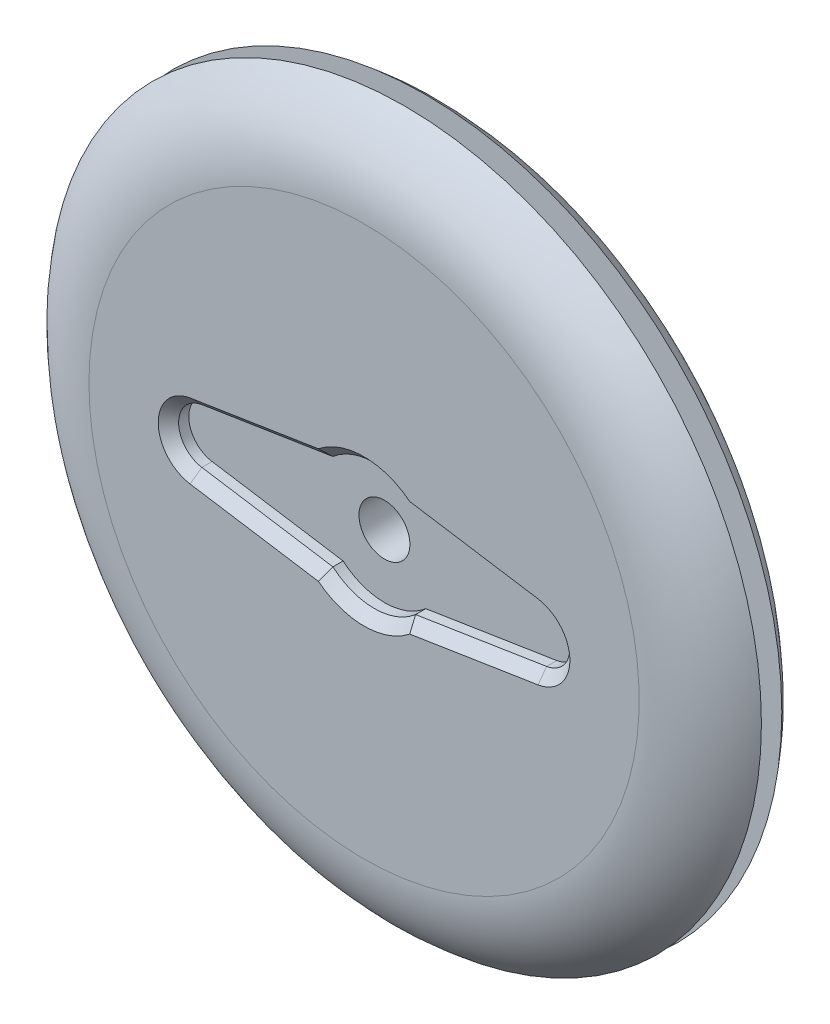
ISO-10303-21;
HEADER;
FILE_DESCRIPTION(('STEP AP214'),'2;1');
FILE_NAME('part.step','',(''),(''),'','','');
FILE_SCHEMA(('AUTOMOTIVE_DESIGN { 1 0 10303 214 1 1 1 1 }'));
ENDSEC;
DATA;
#1=APPLICATION_CONTEXT('core data for automotive mechanical design processes');
#2=APPLICATION_PROTOCOL_DEFINITION('international standard','automotive_design',2000,#1);
#3=PRODUCT_CONTEXT('',#1,'mechanical');
#4=PRODUCT('Part','Part','',(#3));
#5=PRODUCT_RELATED_PRODUCT_CATEGORY('part','',(#4));
#6=PRODUCT_DEFINITION_FORMATION('','',#4);
#7=PRODUCT_DEFINITION_CONTEXT('part definition',#1,'design');
#8=PRODUCT_DEFINITION('design','',#6,#7);
#9=PRODUCT_DEFINITION_SHAPE('','',#8);
#10=(LENGTH_UNIT() NAMED_UNIT(*) SI_UNIT(.MILLI.,.METRE.));
#11=(NAMED_UNIT(*) PLANE_ANGLE_UNIT() SI_UNIT($,.RADIAN.));
#12=(NAMED_UNIT(*) SI_UNIT($,.STERADIAN.) SOLID_ANGLE_UNIT());
#13=UNCERTAINTY_MEASURE_WITH_UNIT(LENGTH_MEASURE(1.E-05),#10,'distance_accuracy_value','');
#14=(GEOMETRIC_REPRESENTATION_CONTEXT(3) GLOBAL_UNCERTAINTY_ASSIGNED_CONTEXT((#13)) GLOBAL_UNIT_ASSIGNED_CONTEXT((#10,
#11,#12)) REPRESENTATION_CONTEXT('',''));
#15=CARTESIAN_POINT('',(0.,0.,0.));
#16=DIRECTION('',(0.,0.,1.));
#17=DIRECTION('',(1.,0.,0.));
#18=AXIS2_PLACEMENT_3D('',#15,#16,#17);
#19=CARTESIAN_POINT('',(0.,0.,0.));
#20=DIRECTION('',(0.,0.,-1.));
#21=DIRECTION('',(-1.,0.,0.));
#22=AXIS2_PLACEMENT_3D('',#19,#20,#21);
#23=PLANE('',#22);
#24=CARTESIAN_POINT('',(0.,0.,0.));
#25=DIRECTION('',(0.,0.,1.));
#26=DIRECTION('',(1.,0.,0.));
#27=AXIS2_PLACEMENT_3D('',#24,#25,#26);
#28=CIRCLE('',#27,2.5);
#29=CARTESIAN_POINT('',(2.5,0.,0.));
#30=VERTEX_POINT('',#29);
#31=EDGE_CURVE('E205',#30,#30,#28,.T.);
#32=ORIENTED_EDGE('',*,*,#31,.F.);
#33=EDGE_LOOP('',(#32));
#34=FACE_BOUND('',#33,.T.);
#35=CARTESIAN_POINT('',(0.,0.,0.));
#36=DIRECTION('',(0.,0.,-1.));
#37=DIRECTION('',(-1.,0.,0.));
#38=AXIS2_PLACEMENT_3D('',#35,#36,#37);
#39=CIRCLE('',#38,6.20000000000002);
#40=CARTESIAN_POINT('',(4.05671289075597,4.68861179049559,0.));
#41=VERTEX_POINT('',#40);
#42=CARTESIAN_POINT('',(-4.05671289075597,4.68861179049559,0.));
#43=VERTEX_POINT('',#42);
#44=EDGE_CURVE('E168',#41,#43,#39,.F.);
#45=ORIENTED_EDGE('',*,*,#44,.T.);
#46=DIRECTION('',(-0.987875892570632,-0.155245679095352,0.));
#47=VECTOR('',#46,1.);
#48=CARTESIAN_POINT('',(-4.05671289075597,4.68861179049559,0.));
#49=LINE('',#48,#47);
#50=CARTESIAN_POINT('',(-16.9191633335575,2.66726490994071,0.));
#51=VERTEX_POINT('',#50);
#52=EDGE_CURVE('E162',#43,#51,#49,.T.);
#53=ORIENTED_EDGE('',*,*,#52,.T.);
#54=CARTESIAN_POINT('',(-16.5,0.,0.));
#55=DIRECTION('',(0.,0.,-1.));
#56=DIRECTION('',(-1.,0.,0.));
#57=AXIS2_PLACEMENT_3D('',#54,#55,#56);
#58=CIRCLE('',#57,2.7);
#59=CARTESIAN_POINT('',(-16.9191633335574,-2.66726490994071,0.));
#60=VERTEX_POINT('',#59);
#61=EDGE_CURVE('E152',#51,#60,#58,.F.);
#62=ORIENTED_EDGE('',*,*,#61,.T.);
#63=DIRECTION('',(0.987875892570632,-0.155245679095352,0.));
#64=VECTOR('',#63,1.);
#65=CARTESIAN_POINT('',(-16.9191633335574,-2.66726490994071,0.));
#66=LINE('',#65,#64);
#67=CARTESIAN_POINT('',(-4.05671289075597,-4.68861179049559,0.));
#68=VERTEX_POINT('',#67);
#69=EDGE_CURVE('E186',#60,#68,#66,.T.);
#70=ORIENTED_EDGE('',*,*,#69,.T.);
#71=CARTESIAN_POINT('',(0.,0.,0.));
#72=DIRECTION('',(0.,0.,-1.));
#73=DIRECTION('',(-1.,0.,0.));
#74=AXIS2_PLACEMENT_3D('',#71,#72,#73);
#75=CIRCLE('',#74,6.2);
#76=CARTESIAN_POINT('',(4.05671289075597,-4.68861179049559,0.));
#77=VERTEX_POINT('',#76);
#78=EDGE_CURVE('E184',#68,#77,#75,.F.);
#79=ORIENTED_EDGE('',*,*,#78,.T.);
#80=DIRECTION('',(0.987875892570632,0.155245679095352,0.));
#81=VECTOR('',#80,1.);
#82=CARTESIAN_POINT('',(4.05671289075597,-4.68861179049559,0.));
#83=LINE('',#82,#81);
#84=CARTESIAN_POINT('',(16.9191633335575,-2.66726490994071,0.));
#85=VERTEX_POINT('',#84);
#86=EDGE_CURVE('E181',#77,#85,#83,.T.);
#87=ORIENTED_EDGE('',*,*,#86,.T.);
#88=CARTESIAN_POINT('',(16.5,0.,0.));
#89=DIRECTION('',(0.,0.,-1.));
#90=DIRECTION('',(-1.,0.,0.));
#91=AXIS2_PLACEMENT_3D('',#88,#89,#90);
#92=CIRCLE('',#91,2.7);
#93=CARTESIAN_POINT('',(16.9191633335575,2.66726490994071,0.));
#94=VERTEX_POINT('',#93);
#95=EDGE_CURVE('E180',#85,#94,#92,.F.);
#96=ORIENTED_EDGE('',*,*,#95,.T.);
#97=DIRECTION('',(-0.987875892570632,0.155245679095352,0.));
#98=VECTOR('',#97,1.);
#99=CARTESIAN_POINT('',(16.9191633335575,2.66726490994071,0.));
#100=LINE('',#99,#98);
#101=EDGE_CURVE('E172',#94,#41,#100,.T.);
#102=ORIENTED_EDGE('',*,*,#101,.T.);
#103=EDGE_LOOP('',(#45,#53,#62,#70,#79,#87,#96,#102));
#104=FACE_BOUND('',#103,.T.);
#105=ADVANCED_FACE('F52',(#34,#104),#23,.F.);
#106=CARTESIAN_POINT('',(0.,0.,-2.));
#107=DIRECTION('',(0.,0.,-1.));
#108=DIRECTION('',(-1.,0.,0.));
#109=AXIS2_PLACEMENT_3D('',#106,#107,#108);
#110=PLANE('',#109);
#111=CARTESIAN_POINT('',(0.,0.,-2.));
#112=DIRECTION('',(0.,0.,-1.));
#113=DIRECTION('',(-1.,0.,0.));
#114=AXIS2_PLACEMENT_3D('',#111,#112,#113);
#115=CIRCLE('',#114,25.);
#116=CARTESIAN_POINT('',(-25.,0.,-2.));
#117=VERTEX_POINT('',#116);
#118=EDGE_CURVE('E213',#117,#117,#115,.T.);
#119=ORIENTED_EDGE('',*,*,#118,.F.);
#120=EDGE_LOOP('',(#119));
#121=FACE_BOUND('',#120,.T.);
#122=CARTESIAN_POINT('',(0.,0.,-2.));
#123=DIRECTION('',(0.,0.,-1.));
#124=DIRECTION('',(-1.,0.,0.));
#125=AXIS2_PLACEMENT_3D('',#122,#123,#124);
#126=CIRCLE('',#125,35.);
#127=CARTESIAN_POINT('',(-35.,0.,-2.));
#128=VERTEX_POINT('',#127);
#129=EDGE_CURVE('E218',#128,#128,#126,.T.);
#130=ORIENTED_EDGE('',*,*,#129,.T.);
#131=EDGE_LOOP('',(#130));
#132=FACE_BOUND('',#131,.T.);
#133=ADVANCED_FACE('F385',(#121,#132),#110,.T.);
#134=CARTESIAN_POINT('',(0.,0.,2.));
#135=DIRECTION('',(0.,0.,-1.));
#136=DIRECTION('',(-1.,0.,0.));
#137=AXIS2_PLACEMENT_3D('',#134,#135,#136);
#138=PLANE('',#137);
#139=CARTESIAN_POINT('',(16.5,0.,2.));
#140=DIRECTION('',(0.,0.,-1.));
#141=DIRECTION('',(-1.,0.,0.));
#142=AXIS2_PLACEMENT_3D('',#139,#140,#141);
#143=CIRCLE('',#142,3.70000000000002);
#144=CARTESIAN_POINT('',(17.0744090126528,3.65514080251136,2.));
#145=VERTEX_POINT('',#144);
#146=CARTESIAN_POINT('',(17.0744090126528,-3.65514080251136,2.));
#147=VERTEX_POINT('',#146);
#148=EDGE_CURVE('E245',#145,#147,#143,.T.);
#149=ORIENTED_EDGE('',*,*,#148,.T.);
#150=DIRECTION('',(-0.987875892570632,-0.155245679095352,0.));
#151=VECTOR('',#150,1.);
#152=CARTESIAN_POINT('',(0.972079157136123,-6.18563795527826,2.));
#153=LINE('',#152,#151);
#154=CARTESIAN_POINT('',(4.48327208773925,-5.63385049387171,2.));
#155=VERTEX_POINT('',#154);
#156=EDGE_CURVE('E242',#147,#155,#153,.T.);
#157=ORIENTED_EDGE('',*,*,#156,.T.);
#158=CARTESIAN_POINT('',(0.,0.,2.));
#159=DIRECTION('',(0.,0.,-1.));
#160=DIRECTION('',(-1.,0.,0.));
#161=AXIS2_PLACEMENT_3D('',#158,#159,#160);
#162=CIRCLE('',#161,7.20000000000003);
#163=CARTESIAN_POINT('',(-4.48327208773927,-5.63385049387169,2.));
#164=VERTEX_POINT('',#163);
#165=EDGE_CURVE('E237',#155,#164,#162,.T.);
#166=ORIENTED_EDGE('',*,*,#165,.T.);
#167=DIRECTION('',(-0.987875892570632,0.155245679095352,0.));
#168=VECTOR('',#167,1.);
#169=CARTESIAN_POINT('',(-0.972079157136121,-6.18563795527825,2.));
#170=LINE('',#169,#168);
#171=CARTESIAN_POINT('',(-17.0744090126528,-3.65514080251135,2.));
#172=VERTEX_POINT('',#171);
#173=EDGE_CURVE('E232',#164,#172,#170,.T.);
#174=ORIENTED_EDGE('',*,*,#173,.T.);
#175=CARTESIAN_POINT('',(-16.5,0.,2.));
#176=DIRECTION('',(0.,0.,-1.));
#177=DIRECTION('',(-1.,0.,0.));
#178=AXIS2_PLACEMENT_3D('',#175,#176,#177);
#179=CIRCLE('',#178,3.70000000000001);
#180=CARTESIAN_POINT('',(-17.0744090126528,3.65514080251135,2.));
#181=VERTEX_POINT('',#180);
#182=EDGE_CURVE('E231',#172,#181,#179,.T.);
#183=ORIENTED_EDGE('',*,*,#182,.T.);
#184=DIRECTION('',(0.987875892570632,0.155245679095352,0.));
#185=VECTOR('',#184,1.);
#186=CARTESIAN_POINT('',(-0.972079157136122,6.18563795527825,2.));
#187=LINE('',#186,#185);
#188=CARTESIAN_POINT('',(-4.48327208773924,5.6338504938717,2.));
#189=VERTEX_POINT('',#188);
#190=EDGE_CURVE('E230',#181,#189,#187,.T.);
#191=ORIENTED_EDGE('',*,*,#190,.T.);
#192=CARTESIAN_POINT('',(0.,0.,2.));
#193=DIRECTION('',(0.,0.,-1.));
#194=DIRECTION('',(-1.,0.,0.));
#195=AXIS2_PLACEMENT_3D('',#192,#193,#194);
#196=CIRCLE('',#195,7.20000000000003);
#197=CARTESIAN_POINT('',(4.48327208773922,5.63385049387171,2.));
#198=VERTEX_POINT('',#197);
#199=EDGE_CURVE('E233',#189,#198,#196,.T.);
#200=ORIENTED_EDGE('',*,*,#199,.T.);
#201=DIRECTION('',(0.987875892570632,-0.155245679095352,0.));
#202=VECTOR('',#201,1.);
#203=CARTESIAN_POINT('',(0.972079157136123,6.18563795527826,2.));
#204=LINE('',#203,#202);
#205=EDGE_CURVE('E240',#198,#145,#204,.T.);
#206=ORIENTED_EDGE('',*,*,#205,.T.);
#207=EDGE_LOOP('',(#149,#157,#166,#174,#183,#191,#200,#206));
#208=FACE_BOUND('',#207,.T.);
#209=CARTESIAN_POINT('',(0.,0.,2.));
#210=DIRECTION('',(0.,0.,-1.));
#211=DIRECTION('',(-1.,0.,0.));
#212=AXIS2_PLACEMENT_3D('',#209,#210,#211);
#213=CIRCLE('',#212,27.);
#214=CARTESIAN_POINT('',(-27.,0.,2.));
#215=VERTEX_POINT('',#214);
#216=EDGE_CURVE('E221',#215,#215,#213,.F.);
#217=ORIENTED_EDGE('',*,*,#216,.T.);
#218=EDGE_LOOP('',(#217));
#219=FACE_BOUND('',#218,.T.);
#220=ADVANCED_FACE('F347',(#208,#219),#138,.F.);
#221=CARTESIAN_POINT('',(0.,0.,-8.));
#222=DIRECTION('',(0.,0.,1.));
#223=DIRECTION('',(1.,0.,0.));
#224=AXIS2_PLACEMENT_3D('',#221,#222,#223);
#225=TOROIDAL_SURFACE('',#224,27.,10.);
#226=ORIENTED_EDGE('',*,*,#216,.F.);
#227=EDGE_LOOP('',(#226));
#228=FACE_BOUND('',#227,.T.);
#229=ORIENTED_EDGE('',*,*,#129,.F.);
#230=EDGE_LOOP('',(#229));
#231=FACE_BOUND('',#230,.T.);
#232=ADVANCED_FACE('F395',(#228,#231),#225,.T.);
#233=CARTESIAN_POINT('',(0.,0.,-4.));
#234=DIRECTION('',(0.,0.,1.));
#235=DIRECTION('',(1.,0.,0.));
#236=AXIS2_PLACEMENT_3D('',#233,#234,#235);
#237=CYLINDRICAL_SURFACE('',#236,25.);
#238=CARTESIAN_POINT('',(0.,0.,-4.));
#239=DIRECTION('',(0.,0.,-1.));
#240=DIRECTION('',(-1.,0.,0.));
#241=AXIS2_PLACEMENT_3D('',#238,#239,#240);
#242=CIRCLE('',#241,25.);
#243=CARTESIAN_POINT('',(-25.,0.,-4.));
#244=VERTEX_POINT('',#243);
#245=EDGE_CURVE('E212',#244,#244,#242,.T.);
#246=ORIENTED_EDGE('',*,*,#245,.F.);
#247=EDGE_LOOP('',(#246));
#248=FACE_BOUND('',#247,.T.);
#249=ORIENTED_EDGE('',*,*,#118,.T.);
#250=EDGE_LOOP('',(#249));
#251=FACE_BOUND('',#250,.T.);
#252=ADVANCED_FACE('F399',(#248,#251),#237,.T.);
#253=CARTESIAN_POINT('',(0.,0.,-4.));
#254=DIRECTION('',(0.,0.,1.));
#255=DIRECTION('',(-1.,0.,0.));
#256=AXIS2_PLACEMENT_3D('',#253,#254,#255);
#257=PLANE('',#256);
#258=ORIENTED_EDGE('',*,*,#245,.T.);
#259=EDGE_LOOP('',(#258));
#260=FACE_BOUND('',#259,.T.);
#261=CARTESIAN_POINT('',(0.,0.,-4.));
#262=DIRECTION('',(0.,0.,-1.));
#263=DIRECTION('',(-1.,0.,0.));
#264=AXIS2_PLACEMENT_3D('',#261,#262,#263);
#265=CIRCLE('',#264,35.);
#266=CARTESIAN_POINT('',(-35.,0.,-4.));
#267=VERTEX_POINT('',#266);
#268=EDGE_CURVE('E206',#267,#267,#265,.T.);
#269=ORIENTED_EDGE('',*,*,#268,.F.);
#270=EDGE_LOOP('',(#269));
#271=FACE_BOUND('',#270,.T.);
#272=ADVANCED_FACE('F403',(#260,#271),#257,.T.);
#273=CARTESIAN_POINT('',(0.,0.,-8.));
#274=DIRECTION('',(0.,0.,1.));
#275=DIRECTION('',(-1.,0.,0.));
#276=AXIS2_PLACEMENT_3D('',#273,#274,#275);
#277=PLANE('',#276);
#278=CARTESIAN_POINT('',(0.,0.,-8.));
#279=DIRECTION('',(0.,0.,1.));
#280=DIRECTION('',(1.,0.,0.));
#281=AXIS2_PLACEMENT_3D('',#278,#279,#280);
#282=CIRCLE('',#281,2.5);
#283=CARTESIAN_POINT('',(2.5,0.,-8.));
#284=VERTEX_POINT('',#283);
#285=EDGE_CURVE('E204',#284,#284,#282,.F.);
#286=ORIENTED_EDGE('',*,*,#285,.F.);
#287=EDGE_LOOP('',(#286));
#288=FACE_BOUND('',#287,.T.);
#289=CARTESIAN_POINT('',(0.,0.,-8.));
#290=DIRECTION('',(0.,0.,-1.));
#291=DIRECTION('',(-1.,0.,0.));
#292=AXIS2_PLACEMENT_3D('',#289,#290,#291);
#293=CIRCLE('',#292,27.);
#294=CARTESIAN_POINT('',(-27.,0.,-8.));
#295=VERTEX_POINT('',#294);
#296=EDGE_CURVE('E214',#295,#295,#293,.F.);
#297=ORIENTED_EDGE('',*,*,#296,.F.);
#298=EDGE_LOOP('',(#297));
#299=FACE_BOUND('',#298,.T.);
#300=ADVANCED_FACE('F414',(#288,#299),#277,.F.);
#301=CARTESIAN_POINT('',(0.,0.,2.));
#302=DIRECTION('',(0.,0.,-1.));
#303=DIRECTION('',(1.,0.,0.));
#304=AXIS2_PLACEMENT_3D('',#301,#302,#303);
#305=TOROIDAL_SURFACE('',#304,27.,10.);
#306=ORIENTED_EDGE('',*,*,#296,.T.);
#307=EDGE_LOOP('',(#306));
#308=FACE_BOUND('',#307,.T.);
#309=ORIENTED_EDGE('',*,*,#268,.T.);
#310=EDGE_LOOP('',(#309));
#311=FACE_BOUND('',#310,.T.);
#312=ADVANCED_FACE('F419',(#308,#311),#305,.T.);
#313=CARTESIAN_POINT('',(0.,0.,-8.001));
#314=DIRECTION('',(0.,0.,1.));
#315=DIRECTION('',(1.,0.,0.));
#316=AXIS2_PLACEMENT_3D('',#313,#314,#315);
#317=CYLINDRICAL_SURFACE('',#316,2.5);
#318=ORIENTED_EDGE('',*,*,#31,.T.);
#319=EDGE_LOOP('',(#318));
#320=FACE_BOUND('',#319,.T.);
#321=ORIENTED_EDGE('',*,*,#285,.T.);
#322=EDGE_LOOP('',(#321));
#323=FACE_BOUND('',#322,.T.);
#324=ADVANCED_FACE('F421',(#320,#323),#317,.F.);
#325=CARTESIAN_POINT('',(-4.05671289075597,4.68861179049559,-40.3524472615974));
#326=DIRECTION('',(-0.155245679095352,0.987875892570632,0.));
#327=DIRECTION('',(-0.987875892570632,-0.155245679095352,0.));
#328=AXIS2_PLACEMENT_3D('',#325,#326,#327);
#329=PLANE('',#328);
#330=DIRECTION('',(0.,0.,1.));
#331=VECTOR('',#330,1.);
#332=CARTESIAN_POINT('',(-4.05671289075597,4.68861179049559,-40.3524472615974));
#333=LINE('',#332,#331);
#334=CARTESIAN_POINT('',(-4.05671289075597,4.68861179049559,1.));
#335=VERTEX_POINT('',#334);
#336=EDGE_CURVE('E175',#43,#335,#333,.T.);
#337=ORIENTED_EDGE('',*,*,#336,.T.);
#338=DIRECTION('',(-0.987875892570632,-0.155245679095352,0.));
#339=VECTOR('',#338,1.);
#340=CARTESIAN_POINT('',(-4.05671289075597,4.68861179049559,1.));
#341=LINE('',#340,#339);
#342=CARTESIAN_POINT('',(-16.9191633335575,2.66726490994071,1.));
#343=VERTEX_POINT('',#342);
#344=EDGE_CURVE('E12',#335,#343,#341,.T.);
#345=ORIENTED_EDGE('',*,*,#344,.T.);
#346=DIRECTION('',(0.,0.,1.));
#347=VECTOR('',#346,1.);
#348=CARTESIAN_POINT('',(-16.9191633335575,2.66726490994071,-40.3524472615974));
#349=LINE('',#348,#347);
#350=EDGE_CURVE('E153',#51,#343,#349,.T.);
#351=ORIENTED_EDGE('',*,*,#350,.F.);
#352=ORIENTED_EDGE('',*,*,#52,.F.);
#353=EDGE_LOOP('',(#337,#345,#351,#352));
#354=FACE_BOUND('',#353,.T.);
#355=ADVANCED_FACE('F163',(#354),#329,.F.);
#356=CARTESIAN_POINT('',(-16.5,0.,-40.3524472615974));
#357=DIRECTION('',(0.,0.,1.));
#358=DIRECTION('',(1.,0.,0.));
#359=AXIS2_PLACEMENT_3D('',#356,#357,#358);
#360=CYLINDRICAL_SURFACE('',#359,2.7);
#361=ORIENTED_EDGE('',*,*,#350,.T.);
#362=CARTESIAN_POINT('',(-16.5,0.,1.));
#363=DIRECTION('',(0.,0.,-1.));
#364=DIRECTION('',(-1.,0.,0.));
#365=AXIS2_PLACEMENT_3D('',#362,#363,#364);
#366=CIRCLE('',#365,2.7);
#367=CARTESIAN_POINT('',(-16.9191633335574,-2.66726490994071,1.));
#368=VERTEX_POINT('',#367);
#369=EDGE_CURVE('E251',#343,#368,#366,.F.);
#370=ORIENTED_EDGE('',*,*,#369,.T.);
#371=DIRECTION('',(0.,0.,1.));
#372=VECTOR('',#371,1.);
#373=CARTESIAN_POINT('',(-16.9191633335574,-2.66726490994071,-40.3524472615974));
#374=LINE('',#373,#372);
#375=EDGE_CURVE('E158',#60,#368,#374,.T.);
#376=ORIENTED_EDGE('',*,*,#375,.F.);
#377=ORIENTED_EDGE('',*,*,#61,.F.);
#378=EDGE_LOOP('',(#361,#370,#376,#377));
#379=FACE_BOUND('',#378,.T.);
#380=ADVANCED_FACE('F155',(#379),#360,.F.);
#381=CARTESIAN_POINT('',(-16.9191633335574,-2.66726490994071,-40.3524472615974));
#382=DIRECTION('',(-0.155245679095352,-0.987875892570632,0.));
#383=DIRECTION('',(0.987875892570632,-0.155245679095352,0.));
#384=AXIS2_PLACEMENT_3D('',#381,#382,#383);
#385=PLANE('',#384);
#386=ORIENTED_EDGE('',*,*,#375,.T.);
#387=DIRECTION('',(0.987875892570632,-0.155245679095352,0.));
#388=VECTOR('',#387,1.);
#389=CARTESIAN_POINT('',(-16.9191633335574,-2.66726490994071,1.));
#390=LINE('',#389,#388);
#391=CARTESIAN_POINT('',(-4.05671289075597,-4.68861179049559,1.));
#392=VERTEX_POINT('',#391);
#393=EDGE_CURVE('E255',#368,#392,#390,.T.);
#394=ORIENTED_EDGE('',*,*,#393,.T.);
#395=DIRECTION('',(0.,0.,1.));
#396=VECTOR('',#395,1.);
#397=CARTESIAN_POINT('',(-4.05671289075597,-4.68861179049559,-40.3524472615974));
#398=LINE('',#397,#396);
#399=EDGE_CURVE('E189',#68,#392,#398,.T.);
#400=ORIENTED_EDGE('',*,*,#399,.F.);
#401=ORIENTED_EDGE('',*,*,#69,.F.);
#402=EDGE_LOOP('',(#386,#394,#400,#401));
#403=FACE_BOUND('',#402,.T.);
#404=ADVANCED_FACE('F357',(#403),#385,.F.);
#405=CARTESIAN_POINT('',(0.,0.,-40.3524472615974));
#406=DIRECTION('',(0.,0.,1.));
#407=DIRECTION('',(1.,0.,0.));
#408=AXIS2_PLACEMENT_3D('',#405,#406,#407);
#409=CYLINDRICAL_SURFACE('',#408,6.2);
#410=ORIENTED_EDGE('',*,*,#399,.T.);
#411=CARTESIAN_POINT('',(0.,0.,0.99999999999998));
#412=DIRECTION('',(0.,0.,-1.));
#413=DIRECTION('',(-1.,0.,0.));
#414=AXIS2_PLACEMENT_3D('',#411,#412,#413);
#415=CIRCLE('',#414,6.2);
#416=CARTESIAN_POINT('',(4.05671289075597,-4.68861179049559,0.99999999999998));
#417=VERTEX_POINT('',#416);
#418=EDGE_CURVE('E228',#392,#417,#415,.F.);
#419=ORIENTED_EDGE('',*,*,#418,.T.);
#420=DIRECTION('',(0.,0.,1.));
#421=VECTOR('',#420,1.);
#422=CARTESIAN_POINT('',(4.05671289075597,-4.68861179049559,-40.3524472615974));
#423=LINE('',#422,#421);
#424=EDGE_CURVE('E183',#77,#417,#423,.T.);
#425=ORIENTED_EDGE('',*,*,#424,.F.);
#426=ORIENTED_EDGE('',*,*,#78,.F.);
#427=EDGE_LOOP('',(#410,#419,#425,#426));
#428=FACE_BOUND('',#427,.T.);
#429=ADVANCED_FACE('F351',(#428),#409,.F.);
#430=CARTESIAN_POINT('',(4.05671289075597,-4.68861179049559,-40.3524472615974));
#431=DIRECTION('',(0.155245679095352,-0.987875892570632,0.));
#432=DIRECTION('',(0.987875892570632,0.155245679095352,0.));
#433=AXIS2_PLACEMENT_3D('',#430,#431,#432);
#434=PLANE('',#433);
#435=ORIENTED_EDGE('',*,*,#424,.T.);
#436=DIRECTION('',(0.987875892570632,0.155245679095352,0.));
#437=VECTOR('',#436,1.);
#438=CARTESIAN_POINT('',(4.05671289075597,-4.68861179049559,0.99999999999998));
#439=LINE('',#438,#437);
#440=CARTESIAN_POINT('',(16.9191633335574,-2.66726490994071,0.99999999999998));
#441=VERTEX_POINT('',#440);
#442=EDGE_CURVE('E246',#417,#441,#439,.T.);
#443=ORIENTED_EDGE('',*,*,#442,.T.);
#444=DIRECTION('',(0.,0.,1.));
#445=VECTOR('',#444,1.);
#446=CARTESIAN_POINT('',(16.9191633335574,-2.66726490994071,-40.3524472615974));
#447=LINE('',#446,#445);
#448=EDGE_CURVE('E179',#85,#441,#447,.T.);
#449=ORIENTED_EDGE('',*,*,#448,.F.);
#450=ORIENTED_EDGE('',*,*,#86,.F.);
#451=EDGE_LOOP('',(#435,#443,#449,#450));
#452=FACE_BOUND('',#451,.T.);
#453=ADVANCED_FACE('F354',(#452),#434,.F.);
#454=CARTESIAN_POINT('',(16.5,0.,-40.3524472615974));
#455=DIRECTION('',(0.,0.,1.));
#456=DIRECTION('',(1.,0.,0.));
#457=AXIS2_PLACEMENT_3D('',#454,#455,#456);
#458=CYLINDRICAL_SURFACE('',#457,2.7);
#459=ORIENTED_EDGE('',*,*,#448,.T.);
#460=CARTESIAN_POINT('',(16.5,0.,0.99999999999998));
#461=DIRECTION('',(0.,0.,-1.));
#462=DIRECTION('',(-1.,0.,0.));
#463=AXIS2_PLACEMENT_3D('',#460,#461,#462);
#464=CIRCLE('',#463,2.7);
#465=CARTESIAN_POINT('',(16.9191633335575,2.66726490994071,0.99999999999998));
#466=VERTEX_POINT('',#465);
#467=EDGE_CURVE('E249',#441,#466,#464,.F.);
#468=ORIENTED_EDGE('',*,*,#467,.T.);
#469=DIRECTION('',(0.,0.,1.));
#470=VECTOR('',#469,1.);
#471=CARTESIAN_POINT('',(16.9191633335575,2.66726490994071,-40.3524472615974));
#472=LINE('',#471,#470);
#473=EDGE_CURVE('E176',#94,#466,#472,.T.);
#474=ORIENTED_EDGE('',*,*,#473,.F.);
#475=ORIENTED_EDGE('',*,*,#95,.F.);
#476=EDGE_LOOP('',(#459,#468,#474,#475));
#477=FACE_BOUND('',#476,.T.);
#478=ADVANCED_FACE('F371',(#477),#458,.F.);
#479=CARTESIAN_POINT('',(16.9191633335575,2.66726490994071,-40.3524472615974));
#480=DIRECTION('',(0.155245679095352,0.987875892570632,0.));
#481=DIRECTION('',(-0.987875892570632,0.155245679095352,0.));
#482=AXIS2_PLACEMENT_3D('',#479,#480,#481);
#483=PLANE('',#482);
#484=ORIENTED_EDGE('',*,*,#473,.T.);
#485=DIRECTION('',(-0.987875892570632,0.155245679095352,0.));
#486=VECTOR('',#485,1.);
#487=CARTESIAN_POINT('',(16.9191633335575,2.66726490994071,0.99999999999998));
#488=LINE('',#487,#486);
#489=CARTESIAN_POINT('',(4.05671289075597,4.68861179049559,1.));
#490=VERTEX_POINT('',#489);
#491=EDGE_CURVE('E247',#466,#490,#488,.T.);
#492=ORIENTED_EDGE('',*,*,#491,.T.);
#493=DIRECTION('',(0.,0.,1.));
#494=VECTOR('',#493,1.);
#495=CARTESIAN_POINT('',(4.05671289075597,4.68861179049559,-40.3524472615974));
#496=LINE('',#495,#494);
#497=EDGE_CURVE('E173',#41,#490,#496,.T.);
#498=ORIENTED_EDGE('',*,*,#497,.F.);
#499=ORIENTED_EDGE('',*,*,#101,.F.);
#500=EDGE_LOOP('',(#484,#492,#498,#499));
#501=FACE_BOUND('',#500,.T.);
#502=ADVANCED_FACE('F373',(#501),#483,.F.);
#503=CARTESIAN_POINT('',(0.,0.,-40.3524472615974));
#504=DIRECTION('',(0.,0.,1.));
#505=DIRECTION('',(1.,0.,0.));
#506=AXIS2_PLACEMENT_3D('',#503,#504,#505);
#507=CYLINDRICAL_SURFACE('',#506,6.20000000000002);
#508=ORIENTED_EDGE('',*,*,#497,.T.);
#509=CARTESIAN_POINT('',(0.,0.,1.));
#510=DIRECTION('',(0.,0.,-1.));
#511=DIRECTION('',(-1.,0.,0.));
#512=AXIS2_PLACEMENT_3D('',#509,#510,#511);
#513=CIRCLE('',#512,6.20000000000002);
#514=EDGE_CURVE('E69',#490,#335,#513,.F.);
#515=ORIENTED_EDGE('',*,*,#514,.T.);
#516=ORIENTED_EDGE('',*,*,#336,.F.);
#517=ORIENTED_EDGE('',*,*,#44,.F.);
#518=EDGE_LOOP('',(#508,#515,#516,#517));
#519=FACE_BOUND('',#518,.T.);
#520=ADVANCED_FACE('F312',(#519),#507,.F.);
#521=CARTESIAN_POINT('',(0.,0.,1.));
#522=DIRECTION('',(0.,0.,1.));
#523=DIRECTION('',(1.,0.,0.));
#524=AXIS2_PLACEMENT_3D('',#521,#522,#523);
#525=CONICAL_SURFACE('',#524,6.20000000000002,0.785398163397453);
#526=CARTESIAN_POINT('',(4.05671289075597,4.68861179049559,1.));
#527=CARTESIAN_POINT('',(4.12951895435172,4.84563624660806,1.16642350152269));
#528=CARTESIAN_POINT('',(4.20146862250485,5.00291845000579,1.33296867368281));
#529=CARTESIAN_POINT('',(4.34365501788445,5.31799801888577,1.66630200752971));
#530=CARTESIAN_POINT('',(4.41389174872573,5.47579538328008,1.83309016870293));
#531=CARTESIAN_POINT('',(4.48327208773922,5.63385049387171,2.));
#532=B_SPLINE_CURVE_WITH_KNOTS('',3,(#526,#527,#528,#529,#530,#531),.UNSPECIFIED.,.F.,.F.,(4,2,
4),(0.,0.720323306304535,1.44064509237618),.UNSPECIFIED.);
#533=EDGE_CURVE('E169',#198,#490,#532,.F.);
#534=ORIENTED_EDGE('',*,*,#533,.F.);
#535=ORIENTED_EDGE('',*,*,#199,.F.);
#536=CARTESIAN_POINT('',(-4.05671289075597,4.68861179049559,1.));
#537=CARTESIAN_POINT('',(-4.12951895435174,4.84563624660805,1.16642350152269));
#538=CARTESIAN_POINT('',(-4.20146862250487,5.00291845000577,1.33296867368281));
#539=CARTESIAN_POINT('',(-4.34365501788447,5.31799801888575,1.66630200752971));
#540=CARTESIAN_POINT('',(-4.41389174872576,5.47579538328006,1.83309016870293));
#541=CARTESIAN_POINT('',(-4.48327208773924,5.6338504938717,2.));
#542=B_SPLINE_CURVE_WITH_KNOTS('',3,(#536,#537,#538,#539,#540,#541),.UNSPECIFIED.,.F.,.F.,(4,2,
4),(0.,0.720323306304533,1.44064509237617),.UNSPECIFIED.);
#543=EDGE_CURVE('E56',#335,#189,#542,.T.);
#544=ORIENTED_EDGE('',*,*,#543,.F.);
#545=ORIENTED_EDGE('',*,*,#514,.F.);
#546=EDGE_LOOP('',(#534,#535,#544,#545));
#547=FACE_BOUND('',#546,.T.);
#548=ADVANCED_FACE('F310',(#547),#525,.F.);
#549=CARTESIAN_POINT('',(-4.05671289075597,4.68861179049559,1.));
#550=DIRECTION('',(-0.109775272438233,0.698533742607404,-0.707106781186551));
#551=DIRECTION('',(-0.987875892570632,-0.155245679095352,0.));
#552=AXIS2_PLACEMENT_3D('',#549,#550,#551);
#553=PLANE('',#552);
#554=ORIENTED_EDGE('',*,*,#543,.T.);
#555=ORIENTED_EDGE('',*,*,#190,.F.);
#556=DIRECTION('',(-0.109775272438235,0.698533742607411,0.707106781186544));
#557=VECTOR('',#556,1.);
#558=CARTESIAN_POINT('',(-16.9191633335575,2.66726490994071,1.));
#559=LINE('',#558,#557);
#560=EDGE_CURVE('E325',#343,#181,#559,.T.);
#561=ORIENTED_EDGE('',*,*,#560,.F.);
#562=ORIENTED_EDGE('',*,*,#344,.F.);
#563=EDGE_LOOP('',(#554,#555,#561,#562));
#564=FACE_BOUND('',#563,.T.);
#565=ADVANCED_FACE('F57',(#564),#553,.F.);
#566=CARTESIAN_POINT('',(16.9191633335575,2.66726490994071,0.99999999999998));
#567=DIRECTION('',(0.109775272438234,0.698533742607407,-0.707106781186548));
#568=DIRECTION('',(-0.987875892570632,0.155245679095352,0.));
#569=AXIS2_PLACEMENT_3D('',#566,#567,#568);
#570=PLANE('',#569);
#571=ORIENTED_EDGE('',*,*,#533,.T.);
#572=ORIENTED_EDGE('',*,*,#491,.F.);
#573=DIRECTION('',(-0.109775272438234,-0.698533742607408,-0.707106781186547));
#574=VECTOR('',#573,1.);
#575=CARTESIAN_POINT('',(17.0744090126528,3.65514080251136,2.));
#576=LINE('',#575,#574);
#577=EDGE_CURVE('E327',#145,#466,#576,.T.);
#578=ORIENTED_EDGE('',*,*,#577,.F.);
#579=ORIENTED_EDGE('',*,*,#205,.F.);
#580=EDGE_LOOP('',(#571,#572,#578,#579));
#581=FACE_BOUND('',#580,.T.);
#582=ADVANCED_FACE('F304',(#581),#570,.F.);
#583=CARTESIAN_POINT('',(-16.5,0.,1.));
#584=DIRECTION('',(0.,0.,1.));
#585=DIRECTION('',(1.,0.,0.));
#586=AXIS2_PLACEMENT_3D('',#583,#584,#585);
#587=CONICAL_SURFACE('',#586,2.7,0.785398163397452);
#588=ORIENTED_EDGE('',*,*,#560,.T.);
#589=ORIENTED_EDGE('',*,*,#182,.F.);
#590=DIRECTION('',(-0.109775272438236,-0.69853374260741,0.707106781186545));
#591=VECTOR('',#590,1.);
#592=CARTESIAN_POINT('',(-16.9191633335574,-2.66726490994071,1.));
#593=LINE('',#592,#591);
#594=EDGE_CURVE('E329',#368,#172,#593,.T.);
#595=ORIENTED_EDGE('',*,*,#594,.F.);
#596=ORIENTED_EDGE('',*,*,#369,.F.);
#597=EDGE_LOOP('',(#588,#589,#595,#596));
#598=FACE_BOUND('',#597,.T.);
#599=ADVANCED_FACE('F299',(#598),#587,.F.);
#600=CARTESIAN_POINT('',(16.5,0.,0.99999999999998));
#601=DIRECTION('',(0.,0.,1.));
#602=DIRECTION('',(1.,0.,0.));
#603=AXIS2_PLACEMENT_3D('',#600,#601,#602);
#604=CONICAL_SURFACE('',#603,2.7,0.785398163397448);
#605=ORIENTED_EDGE('',*,*,#577,.T.);
#606=ORIENTED_EDGE('',*,*,#467,.F.);
#607=DIRECTION('',(-0.109775272438234,0.698533742607407,-0.707106781186548));
#608=VECTOR('',#607,1.);
#609=CARTESIAN_POINT('',(17.0744090126528,-3.65514080251136,2.));
#610=LINE('',#609,#608);
#611=EDGE_CURVE('E333',#147,#441,#610,.T.);
#612=ORIENTED_EDGE('',*,*,#611,.F.);
#613=ORIENTED_EDGE('',*,*,#148,.F.);
#614=EDGE_LOOP('',(#605,#606,#612,#613));
#615=FACE_BOUND('',#614,.T.);
#616=ADVANCED_FACE('F292',(#615),#604,.F.);
#617=CARTESIAN_POINT('',(-16.9191633335574,-2.66726490994071,1.));
#618=DIRECTION('',(-0.109775272438233,-0.698533742607404,-0.707106781186551));
#619=DIRECTION('',(0.987875892570632,-0.155245679095352,0.));
#620=AXIS2_PLACEMENT_3D('',#617,#618,#619);
#621=PLANE('',#620);
#622=ORIENTED_EDGE('',*,*,#594,.T.);
#623=ORIENTED_EDGE('',*,*,#173,.F.);
#624=CARTESIAN_POINT('',(-4.48327208773927,-5.63385049387169,2.));
#625=CARTESIAN_POINT('',(-4.41389174872579,-5.47579538328006,1.83309016870293));
#626=CARTESIAN_POINT('',(-4.34365501788451,-5.31799801888574,1.66630200752971));
#627=CARTESIAN_POINT('',(-4.20146862250491,-5.00291845000576,1.33296867368281));
#628=CARTESIAN_POINT('',(-4.12951895435177,-4.84563624660804,1.16642350152269));
#629=CARTESIAN_POINT('',(-4.05671289075601,-4.68861179049558,0.999999999999995));
#630=B_SPLINE_CURVE_WITH_KNOTS('',3,(#624,#625,#626,#627,#628,#629),.UNSPECIFIED.,.F.,.F.,(4,2,
4),(0.,0.720321786071644,1.44064509237618),.UNSPECIFIED.);
#631=EDGE_CURVE('E261',#392,#164,#630,.F.);
#632=ORIENTED_EDGE('',*,*,#631,.F.);
#633=ORIENTED_EDGE('',*,*,#393,.F.);
#634=EDGE_LOOP('',(#622,#623,#632,#633));
#635=FACE_BOUND('',#634,.T.);
#636=ADVANCED_FACE('F284',(#635),#621,.F.);
#637=CARTESIAN_POINT('',(4.05671289075597,-4.68861179049559,0.99999999999998));
#638=DIRECTION('',(0.109775272438234,-0.698533742607407,-0.707106781186548));
#639=DIRECTION('',(0.987875892570632,0.155245679095352,0.));
#640=AXIS2_PLACEMENT_3D('',#637,#638,#639);
#641=PLANE('',#640);
#642=ORIENTED_EDGE('',*,*,#611,.T.);
#643=ORIENTED_EDGE('',*,*,#442,.F.);
#644=CARTESIAN_POINT('',(4.05671289075597,-4.68861179049559,0.99999999999998));
#645=CARTESIAN_POINT('',(4.12951895435174,-4.84563624660805,1.16642350152268));
#646=CARTESIAN_POINT('',(4.20146862250487,-5.00291845000578,1.3329686736828));
#647=CARTESIAN_POINT('',(4.34365501788448,-5.31799801888576,1.66630200752971));
#648=CARTESIAN_POINT('',(4.41389174872577,-5.47579538328007,1.83309016870292));
#649=CARTESIAN_POINT('',(4.48327208773925,-5.63385049387171,2.));
#650=B_SPLINE_CURVE_WITH_KNOTS('',3,(#644,#645,#646,#647,#648,#649),.UNSPECIFIED.,.F.,.F.,(4,2,
4),(0.,0.720323306304545,1.4406450923762),.UNSPECIFIED.);
#651=EDGE_CURVE('E256',#155,#417,#650,.F.);
#652=ORIENTED_EDGE('',*,*,#651,.F.);
#653=ORIENTED_EDGE('',*,*,#156,.F.);
#654=EDGE_LOOP('',(#642,#643,#652,#653));
#655=FACE_BOUND('',#654,.T.);
#656=ADVANCED_FACE('F271',(#655),#641,.F.);
#657=CARTESIAN_POINT('',(0.,0.,0.99999999999998));
#658=DIRECTION('',(0.,0.,1.));
#659=DIRECTION('',(1.,0.,0.));
#660=AXIS2_PLACEMENT_3D('',#657,#658,#659);
#661=CONICAL_SURFACE('',#660,6.2,0.785398163397449);
#662=ORIENTED_EDGE('',*,*,#631,.T.);
#663=ORIENTED_EDGE('',*,*,#165,.F.);
#664=ORIENTED_EDGE('',*,*,#651,.T.);
#665=ORIENTED_EDGE('',*,*,#418,.F.);
#666=EDGE_LOOP('',(#662,#663,#664,#665));
#667=FACE_BOUND('',#666,.T.);
#668=ADVANCED_FACE('F276',(#667),#661,.F.);
#669=CLOSED_SHELL('',(#105,#133,#220,#232,#252,#272,#300,#312,#324,#355,#380,#404,#429,#453,
#478,#502,#520,#548,#565,#582,#599,#616,#636,#656,#668));
#670=MANIFOLD_SOLID_BREP('B2',#669);
#671=ADVANCED_BREP_SHAPE_REPRESENTATION('',(#18,#670),#14);
#672=SHAPE_DEFINITION_REPRESENTATION(#9,#671);
ENDSEC;
END-ISO-10303-21;
